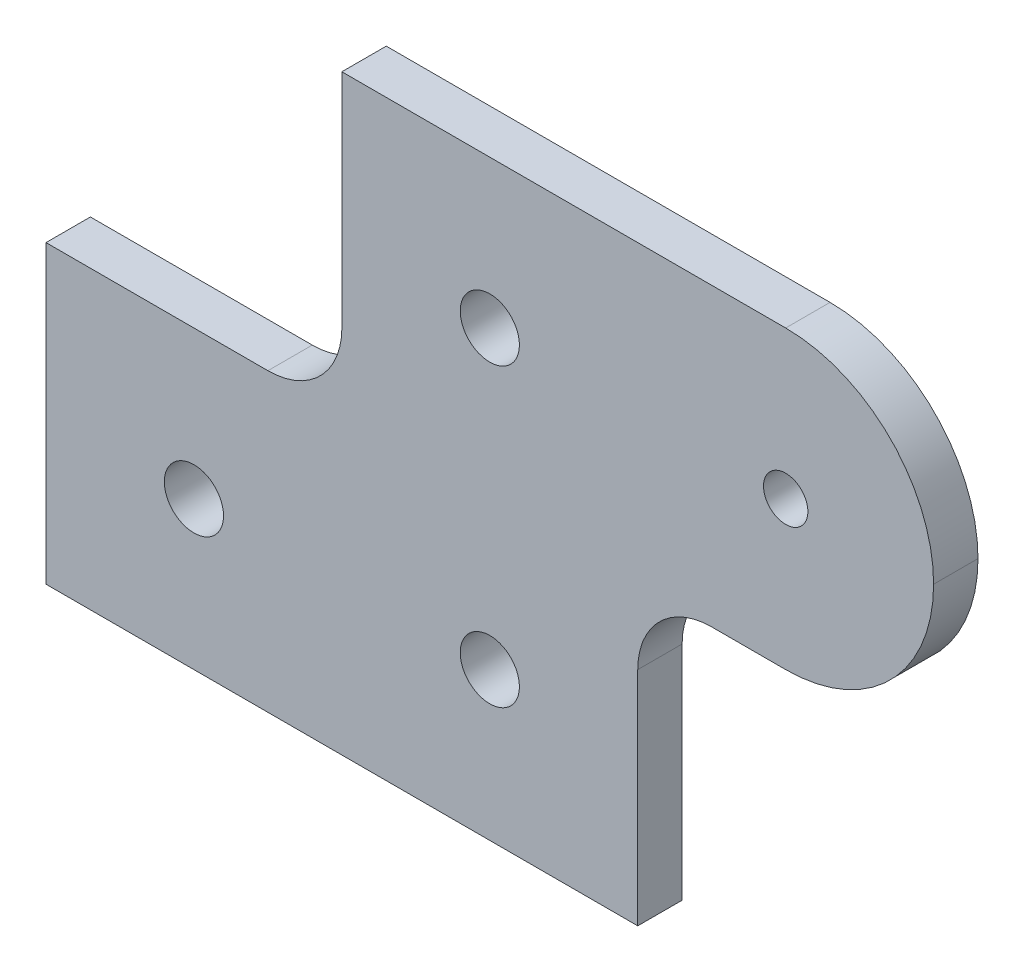
ISO-10303-21;
HEADER;
FILE_DESCRIPTION(('STEP AP214'),'2;1');
FILE_NAME('part.step','',(''),(''),'','','');
FILE_SCHEMA(('AUTOMOTIVE_DESIGN { 1 0 10303 214 1 1 1 1 }'));
ENDSEC;
DATA;
#1=APPLICATION_CONTEXT('core data for automotive mechanical design processes');
#2=APPLICATION_PROTOCOL_DEFINITION('international standard','automotive_design',2000,#1);
#3=PRODUCT_CONTEXT('',#1,'mechanical');
#4=PRODUCT('Part','Part','',(#3));
#5=PRODUCT_RELATED_PRODUCT_CATEGORY('part','',(#4));
#6=PRODUCT_DEFINITION_FORMATION('','',#4);
#7=PRODUCT_DEFINITION_CONTEXT('part definition',#1,'design');
#8=PRODUCT_DEFINITION('design','',#6,#7);
#9=PRODUCT_DEFINITION_SHAPE('','',#8);
#10=(LENGTH_UNIT() NAMED_UNIT(*) SI_UNIT(.MILLI.,.METRE.));
#11=(NAMED_UNIT(*) PLANE_ANGLE_UNIT() SI_UNIT($,.RADIAN.));
#12=(NAMED_UNIT(*) SI_UNIT($,.STERADIAN.) SOLID_ANGLE_UNIT());
#13=UNCERTAINTY_MEASURE_WITH_UNIT(LENGTH_MEASURE(1.E-05),#10,'distance_accuracy_value','');
#14=(GEOMETRIC_REPRESENTATION_CONTEXT(3) GLOBAL_UNCERTAINTY_ASSIGNED_CONTEXT((#13)) GLOBAL_UNIT_ASSIGNED_CONTEXT((#10,
#11,#12)) REPRESENTATION_CONTEXT('',''));
#15=CARTESIAN_POINT('',(0.,0.,0.));
#16=DIRECTION('',(0.,0.,1.));
#17=DIRECTION('',(1.,0.,0.));
#18=AXIS2_PLACEMENT_3D('',#15,#16,#17);
#19=CARTESIAN_POINT('',(0.,0.,3.));
#20=DIRECTION('',(0.,1.,0.));
#21=DIRECTION('',(0.,0.,1.));
#22=AXIS2_PLACEMENT_3D('',#19,#20,#21);
#23=PLANE('',#22);
#24=DIRECTION('',(1.,0.,0.));
#25=VECTOR('',#24,1.);
#26=CARTESIAN_POINT('',(0.,0.,0.));
#27=LINE('',#26,#25);
#28=CARTESIAN_POINT('',(0.,0.,0.));
#29=VERTEX_POINT('',#28);
#30=CARTESIAN_POINT('',(40.,0.,0.));
#31=VERTEX_POINT('',#30);
#32=EDGE_CURVE('E141',#29,#31,#27,.T.);
#33=ORIENTED_EDGE('',*,*,#32,.T.);
#34=DIRECTION('',(0.,0.,-1.));
#35=VECTOR('',#34,1.);
#36=CARTESIAN_POINT('',(40.,0.,3.));
#37=LINE('',#36,#35);
#38=CARTESIAN_POINT('',(40.,0.,3.));
#39=VERTEX_POINT('',#38);
#40=EDGE_CURVE('E121',#39,#31,#37,.T.);
#41=ORIENTED_EDGE('',*,*,#40,.F.);
#42=DIRECTION('',(1.,0.,0.));
#43=VECTOR('',#42,1.);
#44=CARTESIAN_POINT('',(0.,0.,3.));
#45=LINE('',#44,#43);
#46=CARTESIAN_POINT('',(0.,0.,3.));
#47=VERTEX_POINT('',#46);
#48=EDGE_CURVE('E128',#47,#39,#45,.T.);
#49=ORIENTED_EDGE('',*,*,#48,.F.);
#50=DIRECTION('',(0.,0.,-1.));
#51=VECTOR('',#50,1.);
#52=CARTESIAN_POINT('',(0.,0.,3.));
#53=LINE('',#52,#51);
#54=EDGE_CURVE('E217',#47,#29,#53,.T.);
#55=ORIENTED_EDGE('',*,*,#54,.T.);
#56=EDGE_LOOP('',(#33,#41,#49,#55));
#57=FACE_BOUND('',#56,.T.);
#58=ADVANCED_FACE('F35',(#57),#23,.F.);
#59=CARTESIAN_POINT('',(40.,0.,3.));
#60=DIRECTION('',(-1.,0.,0.));
#61=DIRECTION('',(0.,0.,1.));
#62=AXIS2_PLACEMENT_3D('',#59,#60,#61);
#63=PLANE('',#62);
#64=DIRECTION('',(0.,1.,0.));
#65=VECTOR('',#64,1.);
#66=CARTESIAN_POINT('',(40.,0.,0.));
#67=LINE('',#66,#65);
#68=CARTESIAN_POINT('',(40.,15.,0.));
#69=VERTEX_POINT('',#68);
#70=EDGE_CURVE('E191',#31,#69,#67,.T.);
#71=ORIENTED_EDGE('',*,*,#70,.T.);
#72=DIRECTION('',(0.,0.,-1.));
#73=VECTOR('',#72,1.);
#74=CARTESIAN_POINT('',(40.,15.,3.));
#75=LINE('',#74,#73);
#76=CARTESIAN_POINT('',(40.,15.,3.));
#77=VERTEX_POINT('',#76);
#78=EDGE_CURVE('E124',#69,#77,#75,.F.);
#79=ORIENTED_EDGE('',*,*,#78,.T.);
#80=DIRECTION('',(0.,1.,0.));
#81=VECTOR('',#80,1.);
#82=CARTESIAN_POINT('',(40.,0.,3.));
#83=LINE('',#82,#81);
#84=EDGE_CURVE('E116',#39,#77,#83,.T.);
#85=ORIENTED_EDGE('',*,*,#84,.F.);
#86=ORIENTED_EDGE('',*,*,#40,.T.);
#87=EDGE_LOOP('',(#71,#79,#85,#86));
#88=FACE_BOUND('',#87,.T.);
#89=ADVANCED_FACE('F119',(#88),#63,.F.);
#90=CARTESIAN_POINT('',(0.,20.,3.));
#91=DIRECTION('',(0.,1.,0.));
#92=DIRECTION('',(0.,0.,1.));
#93=AXIS2_PLACEMENT_3D('',#90,#91,#92);
#94=PLANE('',#93);
#95=DIRECTION('',(1.,0.,0.));
#96=VECTOR('',#95,1.);
#97=CARTESIAN_POINT('',(0.,20.,3.));
#98=LINE('',#97,#96);
#99=CARTESIAN_POINT('',(45.,20.,3.));
#100=VERTEX_POINT('',#99);
#101=CARTESIAN_POINT('',(50.,20.,3.));
#102=VERTEX_POINT('',#101);
#103=EDGE_CURVE('E127',#100,#102,#98,.T.);
#104=ORIENTED_EDGE('',*,*,#103,.F.);
#105=DIRECTION('',(0.,0.,-1.));
#106=VECTOR('',#105,1.);
#107=CARTESIAN_POINT('',(45.,20.,0.));
#108=LINE('',#107,#106);
#109=CARTESIAN_POINT('',(45.,20.,0.));
#110=VERTEX_POINT('',#109);
#111=EDGE_CURVE('E163',#100,#110,#108,.T.);
#112=ORIENTED_EDGE('',*,*,#111,.T.);
#113=DIRECTION('',(1.,0.,0.));
#114=VECTOR('',#113,1.);
#115=CARTESIAN_POINT('',(0.,20.,0.));
#116=LINE('',#115,#114);
#117=CARTESIAN_POINT('',(50.,20.,0.));
#118=VERTEX_POINT('',#117);
#119=EDGE_CURVE('E192',#110,#118,#116,.T.);
#120=ORIENTED_EDGE('',*,*,#119,.T.);
#121=DIRECTION('',(0.,0.,-1.));
#122=VECTOR('',#121,1.);
#123=CARTESIAN_POINT('',(50.,20.,3.));
#124=LINE('',#123,#122);
#125=EDGE_CURVE('E154',#118,#102,#124,.F.);
#126=ORIENTED_EDGE('',*,*,#125,.T.);
#127=EDGE_LOOP('',(#104,#112,#120,#126));
#128=FACE_BOUND('',#127,.T.);
#129=ADVANCED_FACE('F183',(#128),#94,.F.);
#130=CARTESIAN_POINT('',(0.,40.,3.));
#131=DIRECTION('',(0.,-1.,0.));
#132=DIRECTION('',(0.,0.,-1.));
#133=AXIS2_PLACEMENT_3D('',#130,#131,#132);
#134=PLANE('',#133);
#135=DIRECTION('',(-1.,0.,0.));
#136=VECTOR('',#135,1.);
#137=CARTESIAN_POINT('',(0.,40.,3.));
#138=LINE('',#137,#136);
#139=CARTESIAN_POINT('',(50.,40.,3.));
#140=VERTEX_POINT('',#139);
#141=CARTESIAN_POINT('',(20.,40.,3.));
#142=VERTEX_POINT('',#141);
#143=EDGE_CURVE('E186',#140,#142,#138,.T.);
#144=ORIENTED_EDGE('',*,*,#143,.F.);
#145=DIRECTION('',(0.,0.,-1.));
#146=VECTOR('',#145,1.);
#147=CARTESIAN_POINT('',(50.,40.,0.));
#148=LINE('',#147,#146);
#149=CARTESIAN_POINT('',(50.,40.,0.));
#150=VERTEX_POINT('',#149);
#151=EDGE_CURVE('E161',#140,#150,#148,.T.);
#152=ORIENTED_EDGE('',*,*,#151,.T.);
#153=DIRECTION('',(-1.,0.,0.));
#154=VECTOR('',#153,1.);
#155=CARTESIAN_POINT('',(0.,40.,0.));
#156=LINE('',#155,#154);
#157=CARTESIAN_POINT('',(20.,40.,0.));
#158=VERTEX_POINT('',#157);
#159=EDGE_CURVE('E194',#150,#158,#156,.T.);
#160=ORIENTED_EDGE('',*,*,#159,.T.);
#161=DIRECTION('',(0.,0.,-1.));
#162=VECTOR('',#161,1.);
#163=CARTESIAN_POINT('',(20.,40.,3.));
#164=LINE('',#163,#162);
#165=EDGE_CURVE('E143',#142,#158,#164,.T.);
#166=ORIENTED_EDGE('',*,*,#165,.F.);
#167=EDGE_LOOP('',(#144,#152,#160,#166));
#168=FACE_BOUND('',#167,.T.);
#169=ADVANCED_FACE('F274',(#168),#134,.F.);
#170=CARTESIAN_POINT('',(20.,0.,3.));
#171=DIRECTION('',(-1.,0.,0.));
#172=DIRECTION('',(0.,-1.,0.));
#173=AXIS2_PLACEMENT_3D('',#170,#171,#172);
#174=PLANE('',#173);
#175=DIRECTION('',(0.,1.,0.));
#176=VECTOR('',#175,1.);
#177=CARTESIAN_POINT('',(20.,0.,0.));
#178=LINE('',#177,#176);
#179=CARTESIAN_POINT('',(20.,25.,0.));
#180=VERTEX_POINT('',#179);
#181=EDGE_CURVE('E201',#180,#158,#178,.T.);
#182=ORIENTED_EDGE('',*,*,#181,.F.);
#183=DIRECTION('',(0.,0.,-1.));
#184=VECTOR('',#183,1.);
#185=CARTESIAN_POINT('',(20.,25.,3.));
#186=LINE('',#185,#184);
#187=CARTESIAN_POINT('',(20.,25.,3.));
#188=VERTEX_POINT('',#187);
#189=EDGE_CURVE('E50',#180,#188,#186,.F.);
#190=ORIENTED_EDGE('',*,*,#189,.T.);
#191=DIRECTION('',(0.,1.,0.));
#192=VECTOR('',#191,1.);
#193=CARTESIAN_POINT('',(20.,0.,3.));
#194=LINE('',#193,#192);
#195=EDGE_CURVE('E231',#188,#142,#194,.T.);
#196=ORIENTED_EDGE('',*,*,#195,.T.);
#197=ORIENTED_EDGE('',*,*,#165,.T.);
#198=EDGE_LOOP('',(#182,#190,#196,#197));
#199=FACE_BOUND('',#198,.T.);
#200=ADVANCED_FACE('F277',(#199),#174,.T.);
#201=CARTESIAN_POINT('',(0.,20.,3.));
#202=DIRECTION('',(0.,1.,0.));
#203=DIRECTION('',(0.,0.,1.));
#204=AXIS2_PLACEMENT_3D('',#201,#202,#203);
#205=PLANE('',#204);
#206=DIRECTION('',(1.,0.,0.));
#207=VECTOR('',#206,1.);
#208=CARTESIAN_POINT('',(0.,20.,3.));
#209=LINE('',#208,#207);
#210=CARTESIAN_POINT('',(0.,20.,3.));
#211=VERTEX_POINT('',#210);
#212=CARTESIAN_POINT('',(15.,20.,3.));
#213=VERTEX_POINT('',#212);
#214=EDGE_CURVE('E227',#211,#213,#209,.T.);
#215=ORIENTED_EDGE('',*,*,#214,.T.);
#216=DIRECTION('',(0.,0.,-1.));
#217=VECTOR('',#216,1.);
#218=CARTESIAN_POINT('',(15.,20.,0.));
#219=LINE('',#218,#217);
#220=CARTESIAN_POINT('',(15.,20.,0.));
#221=VERTEX_POINT('',#220);
#222=EDGE_CURVE('E171',#213,#221,#219,.T.);
#223=ORIENTED_EDGE('',*,*,#222,.T.);
#224=DIRECTION('',(1.,0.,0.));
#225=VECTOR('',#224,1.);
#226=CARTESIAN_POINT('',(0.,20.,0.));
#227=LINE('',#226,#225);
#228=CARTESIAN_POINT('',(0.,20.,0.));
#229=VERTEX_POINT('',#228);
#230=EDGE_CURVE('E203',#229,#221,#227,.T.);
#231=ORIENTED_EDGE('',*,*,#230,.F.);
#232=DIRECTION('',(0.,0.,-1.));
#233=VECTOR('',#232,1.);
#234=CARTESIAN_POINT('',(0.,20.,3.));
#235=LINE('',#234,#233);
#236=EDGE_CURVE('E148',#211,#229,#235,.T.);
#237=ORIENTED_EDGE('',*,*,#236,.F.);
#238=EDGE_LOOP('',(#215,#223,#231,#237));
#239=FACE_BOUND('',#238,.T.);
#240=ADVANCED_FACE('F225',(#239),#205,.T.);
#241=CARTESIAN_POINT('',(30.,30.,3.));
#242=DIRECTION('',(0.,0.,-1.));
#243=DIRECTION('',(-1.,0.,0.));
#244=AXIS2_PLACEMENT_3D('',#241,#242,#243);
#245=CYLINDRICAL_SURFACE('',#244,2.);
#246=CARTESIAN_POINT('',(30.,30.,3.));
#247=DIRECTION('',(0.,0.,1.));
#248=DIRECTION('',(1.,0.,0.));
#249=AXIS2_PLACEMENT_3D('',#246,#247,#248);
#250=CIRCLE('',#249,2.);
#251=CARTESIAN_POINT('',(32.,30.,3.));
#252=VERTEX_POINT('',#251);
#253=EDGE_CURVE('E242',#252,#252,#250,.T.);
#254=ORIENTED_EDGE('',*,*,#253,.T.);
#255=EDGE_LOOP('',(#254));
#256=FACE_BOUND('',#255,.T.);
#257=CARTESIAN_POINT('',(30.,30.,0.));
#258=DIRECTION('',(0.,0.,1.));
#259=DIRECTION('',(1.,0.,0.));
#260=AXIS2_PLACEMENT_3D('',#257,#258,#259);
#261=CIRCLE('',#260,2.);
#262=CARTESIAN_POINT('',(32.,30.,0.));
#263=VERTEX_POINT('',#262);
#264=EDGE_CURVE('E211',#263,#263,#261,.T.);
#265=ORIENTED_EDGE('',*,*,#264,.F.);
#266=EDGE_LOOP('',(#265));
#267=FACE_BOUND('',#266,.T.);
#268=ADVANCED_FACE('F282',(#256,#267),#245,.F.);
#269=CARTESIAN_POINT('',(30.,10.,3.));
#270=DIRECTION('',(0.,0.,-1.));
#271=DIRECTION('',(-1.,0.,0.));
#272=AXIS2_PLACEMENT_3D('',#269,#270,#271);
#273=CYLINDRICAL_SURFACE('',#272,2.);
#274=CARTESIAN_POINT('',(30.,10.,3.));
#275=DIRECTION('',(0.,0.,1.));
#276=DIRECTION('',(1.,0.,0.));
#277=AXIS2_PLACEMENT_3D('',#274,#275,#276);
#278=CIRCLE('',#277,2.);
#279=CARTESIAN_POINT('',(32.,10.,3.));
#280=VERTEX_POINT('',#279);
#281=EDGE_CURVE('E239',#280,#280,#278,.T.);
#282=ORIENTED_EDGE('',*,*,#281,.T.);
#283=EDGE_LOOP('',(#282));
#284=FACE_BOUND('',#283,.T.);
#285=CARTESIAN_POINT('',(30.,10.,0.));
#286=DIRECTION('',(0.,0.,1.));
#287=DIRECTION('',(1.,0.,0.));
#288=AXIS2_PLACEMENT_3D('',#285,#286,#287);
#289=CIRCLE('',#288,2.);
#290=CARTESIAN_POINT('',(32.,10.,0.));
#291=VERTEX_POINT('',#290);
#292=EDGE_CURVE('E208',#291,#291,#289,.T.);
#293=ORIENTED_EDGE('',*,*,#292,.F.);
#294=EDGE_LOOP('',(#293));
#295=FACE_BOUND('',#294,.T.);
#296=ADVANCED_FACE('F261',(#284,#295),#273,.F.);
#297=CARTESIAN_POINT('',(0.,0.,3.));
#298=DIRECTION('',(-1.,0.,0.));
#299=DIRECTION('',(0.,0.,1.));
#300=AXIS2_PLACEMENT_3D('',#297,#298,#299);
#301=PLANE('',#300);
#302=DIRECTION('',(0.,1.,0.));
#303=VECTOR('',#302,1.);
#304=CARTESIAN_POINT('',(0.,0.,0.));
#305=LINE('',#304,#303);
#306=EDGE_CURVE('E205',#29,#229,#305,.T.);
#307=ORIENTED_EDGE('',*,*,#306,.F.);
#308=ORIENTED_EDGE('',*,*,#54,.F.);
#309=DIRECTION('',(0.,1.,0.));
#310=VECTOR('',#309,1.);
#311=CARTESIAN_POINT('',(0.,0.,3.));
#312=LINE('',#311,#310);
#313=EDGE_CURVE('E136',#47,#211,#312,.T.);
#314=ORIENTED_EDGE('',*,*,#313,.T.);
#315=ORIENTED_EDGE('',*,*,#236,.T.);
#316=EDGE_LOOP('',(#307,#308,#314,#315));
#317=FACE_BOUND('',#316,.T.);
#318=ADVANCED_FACE('F222',(#317),#301,.T.);
#319=CARTESIAN_POINT('',(10.,10.,3.));
#320=DIRECTION('',(0.,0.,-1.));
#321=DIRECTION('',(-1.,0.,0.));
#322=AXIS2_PLACEMENT_3D('',#319,#320,#321);
#323=CYLINDRICAL_SURFACE('',#322,2.);
#324=CARTESIAN_POINT('',(10.,10.,3.));
#325=DIRECTION('',(0.,0.,1.));
#326=DIRECTION('',(1.,0.,0.));
#327=AXIS2_PLACEMENT_3D('',#324,#325,#326);
#328=CIRCLE('',#327,2.);
#329=CARTESIAN_POINT('',(12.,10.,3.));
#330=VERTEX_POINT('',#329);
#331=EDGE_CURVE('E138',#330,#330,#328,.T.);
#332=ORIENTED_EDGE('',*,*,#331,.T.);
#333=EDGE_LOOP('',(#332));
#334=FACE_BOUND('',#333,.T.);
#335=CARTESIAN_POINT('',(10.,10.,0.));
#336=DIRECTION('',(0.,0.,1.));
#337=DIRECTION('',(1.,0.,0.));
#338=AXIS2_PLACEMENT_3D('',#335,#336,#337);
#339=CIRCLE('',#338,2.);
#340=CARTESIAN_POINT('',(12.,10.,0.));
#341=VERTEX_POINT('',#340);
#342=EDGE_CURVE('E167',#341,#341,#339,.T.);
#343=ORIENTED_EDGE('',*,*,#342,.F.);
#344=EDGE_LOOP('',(#343));
#345=FACE_BOUND('',#344,.T.);
#346=ADVANCED_FACE('F250',(#334,#345),#323,.F.);
#347=CARTESIAN_POINT('',(50.,30.,3.));
#348=DIRECTION('',(0.,0.,-1.));
#349=DIRECTION('',(-1.,0.,0.));
#350=AXIS2_PLACEMENT_3D('',#347,#348,#349);
#351=CYLINDRICAL_SURFACE('',#350,1.5);
#352=CARTESIAN_POINT('',(50.,30.,3.));
#353=DIRECTION('',(0.,0.,1.));
#354=DIRECTION('',(1.,0.,0.));
#355=AXIS2_PLACEMENT_3D('',#352,#353,#354);
#356=CIRCLE('',#355,1.5);
#357=CARTESIAN_POINT('',(51.5,30.,3.));
#358=VERTEX_POINT('',#357);
#359=EDGE_CURVE('E218',#358,#358,#356,.T.);
#360=ORIENTED_EDGE('',*,*,#359,.T.);
#361=EDGE_LOOP('',(#360));
#362=FACE_BOUND('',#361,.T.);
#363=CARTESIAN_POINT('',(50.,30.,0.));
#364=DIRECTION('',(0.,0.,1.));
#365=DIRECTION('',(1.,0.,0.));
#366=AXIS2_PLACEMENT_3D('',#363,#364,#365);
#367=CIRCLE('',#366,1.5);
#368=CARTESIAN_POINT('',(51.5,30.,0.));
#369=VERTEX_POINT('',#368);
#370=EDGE_CURVE('E214',#369,#369,#367,.T.);
#371=ORIENTED_EDGE('',*,*,#370,.F.);
#372=EDGE_LOOP('',(#371));
#373=FACE_BOUND('',#372,.T.);
#374=ADVANCED_FACE('F252',(#362,#373),#351,.F.);
#375=CARTESIAN_POINT('',(0.,0.,3.));
#376=DIRECTION('',(0.,0.,1.));
#377=DIRECTION('',(1.,0.,0.));
#378=AXIS2_PLACEMENT_3D('',#375,#376,#377);
#379=PLANE('',#378);
#380=ORIENTED_EDGE('',*,*,#331,.F.);
#381=EDGE_LOOP('',(#380));
#382=FACE_BOUND('',#381,.T.);
#383=ORIENTED_EDGE('',*,*,#84,.T.);
#384=CARTESIAN_POINT('',(45.,15.,3.));
#385=DIRECTION('',(0.,0.,1.));
#386=DIRECTION('',(1.,0.,0.));
#387=AXIS2_PLACEMENT_3D('',#384,#385,#386);
#388=CIRCLE('',#387,5.);
#389=EDGE_CURVE('E177',#77,#100,#388,.F.);
#390=ORIENTED_EDGE('',*,*,#389,.T.);
#391=ORIENTED_EDGE('',*,*,#103,.T.);
#392=CARTESIAN_POINT('',(50.,30.,3.));
#393=DIRECTION('',(0.,0.,1.));
#394=DIRECTION('',(1.,0.,0.));
#395=AXIS2_PLACEMENT_3D('',#392,#393,#394);
#396=CIRCLE('',#395,10.);
#397=CARTESIAN_POINT('',(60.,30.,3.));
#398=VERTEX_POINT('',#397);
#399=EDGE_CURVE('E159',#102,#398,#396,.T.);
#400=ORIENTED_EDGE('',*,*,#399,.T.);
#401=CARTESIAN_POINT('',(50.,30.,3.));
#402=DIRECTION('',(0.,0.,1.));
#403=DIRECTION('',(1.,0.,0.));
#404=AXIS2_PLACEMENT_3D('',#401,#402,#403);
#405=CIRCLE('',#404,10.);
#406=EDGE_CURVE('E157',#398,#140,#405,.T.);
#407=ORIENTED_EDGE('',*,*,#406,.T.);
#408=ORIENTED_EDGE('',*,*,#143,.T.);
#409=ORIENTED_EDGE('',*,*,#195,.F.);
#410=CARTESIAN_POINT('',(15.,25.,3.));
#411=DIRECTION('',(0.,0.,1.));
#412=DIRECTION('',(1.,0.,0.));
#413=AXIS2_PLACEMENT_3D('',#410,#411,#412);
#414=CIRCLE('',#413,5.);
#415=EDGE_CURVE('E11',#188,#213,#414,.F.);
#416=ORIENTED_EDGE('',*,*,#415,.T.);
#417=ORIENTED_EDGE('',*,*,#214,.F.);
#418=ORIENTED_EDGE('',*,*,#313,.F.);
#419=ORIENTED_EDGE('',*,*,#48,.T.);
#420=EDGE_LOOP('',(#383,#390,#391,#400,#407,#408,#409,#416,#417,#418,#419));
#421=FACE_BOUND('',#420,.T.);
#422=ORIENTED_EDGE('',*,*,#281,.F.);
#423=EDGE_LOOP('',(#422));
#424=FACE_BOUND('',#423,.T.);
#425=ORIENTED_EDGE('',*,*,#253,.F.);
#426=EDGE_LOOP('',(#425));
#427=FACE_BOUND('',#426,.T.);
#428=ORIENTED_EDGE('',*,*,#359,.F.);
#429=EDGE_LOOP('',(#428));
#430=FACE_BOUND('',#429,.T.);
#431=ADVANCED_FACE('F132',(#382,#421,#424,#427,#430),#379,.T.);
#432=CARTESIAN_POINT('',(0.,0.,0.));
#433=DIRECTION('',(0.,0.,1.));
#434=DIRECTION('',(1.,0.,0.));
#435=AXIS2_PLACEMENT_3D('',#432,#433,#434);
#436=PLANE('',#435);
#437=ORIENTED_EDGE('',*,*,#342,.T.);
#438=EDGE_LOOP('',(#437));
#439=FACE_BOUND('',#438,.T.);
#440=CARTESIAN_POINT('',(50.,30.,0.));
#441=DIRECTION('',(0.,0.,1.));
#442=DIRECTION('',(1.,0.,0.));
#443=AXIS2_PLACEMENT_3D('',#440,#441,#442);
#444=CIRCLE('',#443,10.);
#445=CARTESIAN_POINT('',(60.,30.,0.));
#446=VERTEX_POINT('',#445);
#447=EDGE_CURVE('E142',#150,#446,#444,.F.);
#448=ORIENTED_EDGE('',*,*,#447,.T.);
#449=CARTESIAN_POINT('',(50.,30.,0.));
#450=DIRECTION('',(0.,0.,1.));
#451=DIRECTION('',(1.,0.,0.));
#452=AXIS2_PLACEMENT_3D('',#449,#450,#451);
#453=CIRCLE('',#452,10.);
#454=EDGE_CURVE('E145',#446,#118,#453,.F.);
#455=ORIENTED_EDGE('',*,*,#454,.T.);
#456=ORIENTED_EDGE('',*,*,#119,.F.);
#457=CARTESIAN_POINT('',(45.,15.,0.));
#458=DIRECTION('',(0.,0.,1.));
#459=DIRECTION('',(1.,0.,0.));
#460=AXIS2_PLACEMENT_3D('',#457,#458,#459);
#461=CIRCLE('',#460,5.);
#462=EDGE_CURVE('E175',#110,#69,#461,.T.);
#463=ORIENTED_EDGE('',*,*,#462,.T.);
#464=ORIENTED_EDGE('',*,*,#70,.F.);
#465=ORIENTED_EDGE('',*,*,#32,.F.);
#466=ORIENTED_EDGE('',*,*,#306,.T.);
#467=ORIENTED_EDGE('',*,*,#230,.T.);
#468=CARTESIAN_POINT('',(15.,25.,0.));
#469=DIRECTION('',(0.,0.,1.));
#470=DIRECTION('',(1.,0.,0.));
#471=AXIS2_PLACEMENT_3D('',#468,#469,#470);
#472=CIRCLE('',#471,5.);
#473=EDGE_CURVE('E43',#221,#180,#472,.T.);
#474=ORIENTED_EDGE('',*,*,#473,.T.);
#475=ORIENTED_EDGE('',*,*,#181,.T.);
#476=ORIENTED_EDGE('',*,*,#159,.F.);
#477=EDGE_LOOP('',(#448,#455,#456,#463,#464,#465,#466,#467,#474,#475,#476));
#478=FACE_BOUND('',#477,.T.);
#479=ORIENTED_EDGE('',*,*,#292,.T.);
#480=EDGE_LOOP('',(#479));
#481=FACE_BOUND('',#480,.T.);
#482=ORIENTED_EDGE('',*,*,#264,.T.);
#483=EDGE_LOOP('',(#482));
#484=FACE_BOUND('',#483,.T.);
#485=ORIENTED_EDGE('',*,*,#370,.T.);
#486=EDGE_LOOP('',(#485));
#487=FACE_BOUND('',#486,.T.);
#488=ADVANCED_FACE('F189',(#439,#478,#481,#484,#487),#436,.F.);
#489=CARTESIAN_POINT('',(50.,30.,3.));
#490=DIRECTION('',(0.,0.,1.));
#491=DIRECTION('',(1.,0.,0.));
#492=AXIS2_PLACEMENT_3D('',#489,#490,#491);
#493=CYLINDRICAL_SURFACE('',#492,10.);
#494=ORIENTED_EDGE('',*,*,#151,.F.);
#495=ORIENTED_EDGE('',*,*,#406,.F.);
#496=DIRECTION('',(0.,0.,-1.));
#497=VECTOR('',#496,1.);
#498=CARTESIAN_POINT('',(60.,30.,3.));
#499=LINE('',#498,#497);
#500=EDGE_CURVE('E164',#446,#398,#499,.F.);
#501=ORIENTED_EDGE('',*,*,#500,.F.);
#502=ORIENTED_EDGE('',*,*,#447,.F.);
#503=EDGE_LOOP('',(#494,#495,#501,#502));
#504=FACE_BOUND('',#503,.T.);
#505=ADVANCED_FACE('F292',(#504),#493,.T.);
#506=CARTESIAN_POINT('',(50.,30.,3.));
#507=DIRECTION('',(0.,0.,1.));
#508=DIRECTION('',(1.,0.,0.));
#509=AXIS2_PLACEMENT_3D('',#506,#507,#508);
#510=CYLINDRICAL_SURFACE('',#509,10.);
#511=ORIENTED_EDGE('',*,*,#399,.F.);
#512=ORIENTED_EDGE('',*,*,#125,.F.);
#513=ORIENTED_EDGE('',*,*,#454,.F.);
#514=ORIENTED_EDGE('',*,*,#500,.T.);
#515=EDGE_LOOP('',(#511,#512,#513,#514));
#516=FACE_BOUND('',#515,.T.);
#517=ADVANCED_FACE('F313',(#516),#510,.T.);
#518=CARTESIAN_POINT('',(45.,15.,3.));
#519=DIRECTION('',(0.,0.,1.));
#520=DIRECTION('',(1.,0.,0.));
#521=AXIS2_PLACEMENT_3D('',#518,#519,#520);
#522=CYLINDRICAL_SURFACE('',#521,5.);
#523=ORIENTED_EDGE('',*,*,#389,.F.);
#524=ORIENTED_EDGE('',*,*,#78,.F.);
#525=ORIENTED_EDGE('',*,*,#462,.F.);
#526=ORIENTED_EDGE('',*,*,#111,.F.);
#527=EDGE_LOOP('',(#523,#524,#525,#526));
#528=FACE_BOUND('',#527,.T.);
#529=ADVANCED_FACE('F188',(#528),#522,.F.);
#530=CARTESIAN_POINT('',(15.,25.,3.));
#531=DIRECTION('',(0.,0.,1.));
#532=DIRECTION('',(1.,0.,0.));
#533=AXIS2_PLACEMENT_3D('',#530,#531,#532);
#534=CYLINDRICAL_SURFACE('',#533,5.);
#535=ORIENTED_EDGE('',*,*,#415,.F.);
#536=ORIENTED_EDGE('',*,*,#189,.F.);
#537=ORIENTED_EDGE('',*,*,#473,.F.);
#538=ORIENTED_EDGE('',*,*,#222,.F.);
#539=EDGE_LOOP('',(#535,#536,#537,#538));
#540=FACE_BOUND('',#539,.T.);
#541=ADVANCED_FACE('F37',(#540),#534,.F.);
#542=CLOSED_SHELL('',(#58,#89,#129,#169,#200,#240,#268,#296,#318,#346,#374,#431,#488,#505,#517,
#529,#541));
#543=MANIFOLD_SOLID_BREP('B2',#542);
#544=ADVANCED_BREP_SHAPE_REPRESENTATION('',(#18,#543),#14);
#545=SHAPE_DEFINITION_REPRESENTATION(#9,#544);
ENDSEC;
END-ISO-10303-21;
